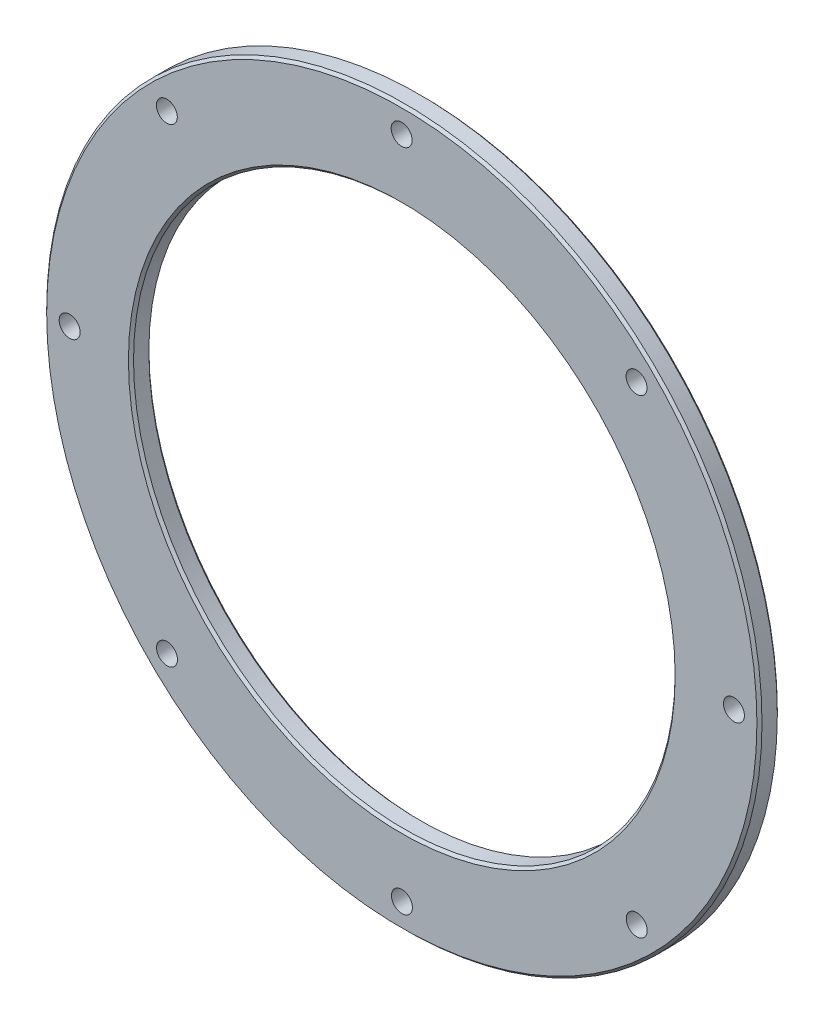
ISO-10303-21;
HEADER;
FILE_DESCRIPTION(('STEP AP214'),'2;1');
FILE_NAME('part.step','',(''),(''),'','','');
FILE_SCHEMA(('AUTOMOTIVE_DESIGN { 1 0 10303 214 1 1 1 1 }'));
ENDSEC;
DATA;
#1=APPLICATION_CONTEXT('core data for automotive mechanical design processes');
#2=APPLICATION_PROTOCOL_DEFINITION('international standard','automotive_design',2000,#1);
#3=PRODUCT_CONTEXT('',#1,'mechanical');
#4=PRODUCT('Part','Part','',(#3));
#5=PRODUCT_RELATED_PRODUCT_CATEGORY('part','',(#4));
#6=PRODUCT_DEFINITION_FORMATION('','',#4);
#7=PRODUCT_DEFINITION_CONTEXT('part definition',#1,'design');
#8=PRODUCT_DEFINITION('design','',#6,#7);
#9=PRODUCT_DEFINITION_SHAPE('','',#8);
#10=(LENGTH_UNIT() NAMED_UNIT(*) SI_UNIT(.MILLI.,.METRE.));
#11=(NAMED_UNIT(*) PLANE_ANGLE_UNIT() SI_UNIT($,.RADIAN.));
#12=(NAMED_UNIT(*) SI_UNIT($,.STERADIAN.) SOLID_ANGLE_UNIT());
#13=UNCERTAINTY_MEASURE_WITH_UNIT(LENGTH_MEASURE(1.E-05),#10,'distance_accuracy_value','');
#14=(GEOMETRIC_REPRESENTATION_CONTEXT(3) GLOBAL_UNCERTAINTY_ASSIGNED_CONTEXT((#13)) GLOBAL_UNIT_ASSIGNED_CONTEXT((#10,
#11,#12)) REPRESENTATION_CONTEXT('',''));
#15=CARTESIAN_POINT('',(0.,0.,0.));
#16=DIRECTION('',(0.,0.,1.));
#17=DIRECTION('',(1.,0.,0.));
#18=AXIS2_PLACEMENT_3D('',#15,#16,#17);
#19=CARTESIAN_POINT('',(0.,0.,0.));
#20=DIRECTION('',(0.,0.,-1.));
#21=DIRECTION('',(-1.,0.,0.));
#22=AXIS2_PLACEMENT_3D('',#19,#20,#21);
#23=CYLINDRICAL_SURFACE('',#22,140.);
#24=CARTESIAN_POINT('',(0.,0.,-7.00000000000006));
#25=DIRECTION('',(0.,0.,1.));
#26=DIRECTION('',(1.,0.,0.));
#27=AXIS2_PLACEMENT_3D('',#24,#25,#26);
#28=CIRCLE('',#27,140.);
#29=CARTESIAN_POINT('',(140.,0.,-7.00000000000006));
#30=VERTEX_POINT('',#29);
#31=EDGE_CURVE('E10',#30,#30,#28,.T.);
#32=ORIENTED_EDGE('',*,*,#31,.T.);
#33=EDGE_LOOP('',(#32));
#34=FACE_BOUND('',#33,.T.);
#35=CARTESIAN_POINT('',(0.,0.,-1.00000000000003));
#36=DIRECTION('',(0.,0.,1.));
#37=DIRECTION('',(1.,0.,0.));
#38=AXIS2_PLACEMENT_3D('',#35,#36,#37);
#39=CIRCLE('',#38,140.);
#40=CARTESIAN_POINT('',(140.,0.,-1.00000000000003));
#41=VERTEX_POINT('',#40);
#42=EDGE_CURVE('E57',#41,#41,#39,.F.);
#43=ORIENTED_EDGE('',*,*,#42,.T.);
#44=EDGE_LOOP('',(#43));
#45=FACE_BOUND('',#44,.T.);
#46=ADVANCED_FACE('F49',(#34,#45),#23,.T.);
#47=CARTESIAN_POINT('',(0.,0.,0.));
#48=DIRECTION('',(0.,0.,1.));
#49=DIRECTION('',(1.,0.,0.));
#50=AXIS2_PLACEMENT_3D('',#47,#48,#49);
#51=PLANE('',#50);
#52=CARTESIAN_POINT('',(0.,0.,0.));
#53=DIRECTION('',(0.,0.,1.));
#54=DIRECTION('',(1.,0.,0.));
#55=AXIS2_PLACEMENT_3D('',#52,#53,#54);
#56=CIRCLE('',#55,107.);
#57=CARTESIAN_POINT('',(107.,0.,0.));
#58=VERTEX_POINT('',#57);
#59=EDGE_CURVE('E76',#58,#58,#56,.F.);
#60=ORIENTED_EDGE('',*,*,#59,.T.);
#61=EDGE_LOOP('',(#60));
#62=FACE_BOUND('',#61,.T.);
#63=CARTESIAN_POINT('',(0.,0.,0.));
#64=DIRECTION('',(0.,0.,1.));
#65=DIRECTION('',(1.,0.,0.));
#66=AXIS2_PLACEMENT_3D('',#63,#64,#65);
#67=CIRCLE('',#66,139.);
#68=CARTESIAN_POINT('',(139.,0.,0.));
#69=VERTEX_POINT('',#68);
#70=EDGE_CURVE('E79',#69,#69,#67,.T.);
#71=ORIENTED_EDGE('',*,*,#70,.T.);
#72=EDGE_LOOP('',(#71));
#73=FACE_BOUND('',#72,.T.);
#74=CARTESIAN_POINT('',(-0.0514447332705628,129.99998982092,0.));
#75=DIRECTION('',(0.,0.,-1.));
#76=DIRECTION('',(1.,0.,0.));
#77=AXIS2_PLACEMENT_3D('',#74,#75,#76);
#78=CIRCLE('',#77,4.1);
#79=CARTESIAN_POINT('',(4.04855526672944,129.99998982092,0.));
#80=VERTEX_POINT('',#79);
#81=EDGE_CURVE('E122',#80,#80,#78,.T.);
#82=ORIENTED_EDGE('',*,*,#81,.T.);
#83=EDGE_LOOP('',(#82));
#84=FACE_BOUND('',#83,.T.);
#85=CARTESIAN_POINT('',(91.8874974368031,91.9602512763069,0.));
#86=DIRECTION('',(0.,0.,-1.));
#87=DIRECTION('',(1.,0.,0.));
#88=AXIS2_PLACEMENT_3D('',#85,#86,#87);
#89=CIRCLE('',#88,4.10000000000001);
#90=CARTESIAN_POINT('',(95.9874974368031,91.9602512763069,0.));
#91=VERTEX_POINT('',#90);
#92=EDGE_CURVE('E116',#91,#91,#89,.T.);
#93=ORIENTED_EDGE('',*,*,#92,.T.);
#94=EDGE_LOOP('',(#93));
#95=FACE_BOUND('',#94,.T.);
#96=CARTESIAN_POINT('',(129.99998982092,0.0514447332705389,0.));
#97=DIRECTION('',(0.,0.,-1.));
#98=DIRECTION('',(1.,0.,0.));
#99=AXIS2_PLACEMENT_3D('',#96,#97,#98);
#100=CIRCLE('',#99,4.09999999999999);
#101=CARTESIAN_POINT('',(134.09998982092,0.0514447332705389,0.));
#102=VERTEX_POINT('',#101);
#103=EDGE_CURVE('E110',#102,#102,#100,.T.);
#104=ORIENTED_EDGE('',*,*,#103,.T.);
#105=EDGE_LOOP('',(#104));
#106=FACE_BOUND('',#105,.T.);
#107=CARTESIAN_POINT('',(91.960251276307,-91.8874974368031,0.));
#108=DIRECTION('',(0.,0.,-1.));
#109=DIRECTION('',(1.,0.,0.));
#110=AXIS2_PLACEMENT_3D('',#107,#108,#109);
#111=CIRCLE('',#110,4.10000000000001);
#112=CARTESIAN_POINT('',(96.060251276307,-91.8874974368031,0.));
#113=VERTEX_POINT('',#112);
#114=EDGE_CURVE('E104',#113,#113,#111,.T.);
#115=ORIENTED_EDGE('',*,*,#114,.T.);
#116=EDGE_LOOP('',(#115));
#117=FACE_BOUND('',#116,.T.);
#118=CARTESIAN_POINT('',(0.0514447332705469,-129.99998982092,0.));
#119=DIRECTION('',(0.,0.,-1.));
#120=DIRECTION('',(1.,0.,0.));
#121=AXIS2_PLACEMENT_3D('',#118,#119,#120);
#122=CIRCLE('',#121,4.1);
#123=CARTESIAN_POINT('',(4.15144473327055,-129.99998982092,0.));
#124=VERTEX_POINT('',#123);
#125=EDGE_CURVE('E98',#124,#124,#122,.T.);
#126=ORIENTED_EDGE('',*,*,#125,.T.);
#127=EDGE_LOOP('',(#126));
#128=FACE_BOUND('',#127,.T.);
#129=CARTESIAN_POINT('',(-91.887497436803,-91.960251276307,0.));
#130=DIRECTION('',(0.,0.,-1.));
#131=DIRECTION('',(1.,0.,0.));
#132=AXIS2_PLACEMENT_3D('',#129,#130,#131);
#133=CIRCLE('',#132,4.10000000000001);
#134=CARTESIAN_POINT('',(-87.787497436803,-91.960251276307,0.));
#135=VERTEX_POINT('',#134);
#136=EDGE_CURVE('E92',#135,#135,#133,.T.);
#137=ORIENTED_EDGE('',*,*,#136,.T.);
#138=EDGE_LOOP('',(#137));
#139=FACE_BOUND('',#138,.T.);
#140=CARTESIAN_POINT('',(-129.99998982092,-0.0514447332705837,0.));
#141=DIRECTION('',(0.,0.,-1.));
#142=DIRECTION('',(1.,0.,0.));
#143=AXIS2_PLACEMENT_3D('',#140,#141,#142);
#144=CIRCLE('',#143,4.09999999999999);
#145=CARTESIAN_POINT('',(-125.89998982092,-0.0514447332705837,0.));
#146=VERTEX_POINT('',#145);
#147=EDGE_CURVE('E86',#146,#146,#144,.T.);
#148=ORIENTED_EDGE('',*,*,#147,.T.);
#149=EDGE_LOOP('',(#148));
#150=FACE_BOUND('',#149,.T.);
#151=CARTESIAN_POINT('',(-91.9602512763069,91.8874974368031,0.));
#152=DIRECTION('',(0.,0.,-1.));
#153=DIRECTION('',(1.,0.,0.));
#154=AXIS2_PLACEMENT_3D('',#151,#152,#153);
#155=CIRCLE('',#154,4.10000000000001);
#156=CARTESIAN_POINT('',(-87.8602512763069,91.8874974368031,0.));
#157=VERTEX_POINT('',#156);
#158=EDGE_CURVE('E82',#157,#157,#155,.T.);
#159=ORIENTED_EDGE('',*,*,#158,.T.);
#160=EDGE_LOOP('',(#159));
#161=FACE_BOUND('',#160,.T.);
#162=ADVANCED_FACE('F131',(#62,#73,#84,#95,#106,#117,#128,#139,#150,#161),#51,.T.);
#163=CARTESIAN_POINT('',(0.,0.,-8.));
#164=DIRECTION('',(0.,0.,1.));
#165=DIRECTION('',(1.,0.,0.));
#166=AXIS2_PLACEMENT_3D('',#163,#164,#165);
#167=PLANE('',#166);
#168=CARTESIAN_POINT('',(0.,0.,-8.));
#169=DIRECTION('',(0.,0.,1.));
#170=DIRECTION('',(1.,0.,0.));
#171=AXIS2_PLACEMENT_3D('',#168,#169,#170);
#172=CIRCLE('',#171,107.);
#173=CARTESIAN_POINT('',(107.,0.,-8.));
#174=VERTEX_POINT('',#173);
#175=EDGE_CURVE('E61',#174,#174,#172,.T.);
#176=ORIENTED_EDGE('',*,*,#175,.T.);
#177=EDGE_LOOP('',(#176));
#178=FACE_BOUND('',#177,.T.);
#179=CARTESIAN_POINT('',(0.,0.,-8.));
#180=DIRECTION('',(0.,0.,1.));
#181=DIRECTION('',(1.,0.,0.));
#182=AXIS2_PLACEMENT_3D('',#179,#180,#181);
#183=CIRCLE('',#182,139.);
#184=CARTESIAN_POINT('',(139.,0.,-8.));
#185=VERTEX_POINT('',#184);
#186=EDGE_CURVE('E65',#185,#185,#183,.F.);
#187=ORIENTED_EDGE('',*,*,#186,.T.);
#188=EDGE_LOOP('',(#187));
#189=FACE_BOUND('',#188,.T.);
#190=CARTESIAN_POINT('',(-0.0514447332705628,129.99998982092,-8.));
#191=DIRECTION('',(0.,0.,-1.));
#192=DIRECTION('',(1.,0.,0.));
#193=AXIS2_PLACEMENT_3D('',#190,#191,#192);
#194=CIRCLE('',#193,4.1);
#195=CARTESIAN_POINT('',(4.04855526672944,129.99998982092,-8.));
#196=VERTEX_POINT('',#195);
#197=EDGE_CURVE('E125',#196,#196,#194,.T.);
#198=ORIENTED_EDGE('',*,*,#197,.F.);
#199=EDGE_LOOP('',(#198));
#200=FACE_BOUND('',#199,.T.);
#201=CARTESIAN_POINT('',(91.8874974368031,91.9602512763069,-8.));
#202=DIRECTION('',(0.,0.,-1.));
#203=DIRECTION('',(1.,0.,0.));
#204=AXIS2_PLACEMENT_3D('',#201,#202,#203);
#205=CIRCLE('',#204,4.10000000000001);
#206=CARTESIAN_POINT('',(95.9874974368031,91.9602512763069,-8.));
#207=VERTEX_POINT('',#206);
#208=EDGE_CURVE('E119',#207,#207,#205,.T.);
#209=ORIENTED_EDGE('',*,*,#208,.F.);
#210=EDGE_LOOP('',(#209));
#211=FACE_BOUND('',#210,.T.);
#212=CARTESIAN_POINT('',(129.99998982092,0.0514447332705389,-8.));
#213=DIRECTION('',(0.,0.,-1.));
#214=DIRECTION('',(1.,0.,0.));
#215=AXIS2_PLACEMENT_3D('',#212,#213,#214);
#216=CIRCLE('',#215,4.09999999999999);
#217=CARTESIAN_POINT('',(134.09998982092,0.0514447332705389,-8.));
#218=VERTEX_POINT('',#217);
#219=EDGE_CURVE('E113',#218,#218,#216,.T.);
#220=ORIENTED_EDGE('',*,*,#219,.F.);
#221=EDGE_LOOP('',(#220));
#222=FACE_BOUND('',#221,.T.);
#223=CARTESIAN_POINT('',(91.960251276307,-91.8874974368031,-8.));
#224=DIRECTION('',(0.,0.,-1.));
#225=DIRECTION('',(1.,0.,0.));
#226=AXIS2_PLACEMENT_3D('',#223,#224,#225);
#227=CIRCLE('',#226,4.10000000000001);
#228=CARTESIAN_POINT('',(96.060251276307,-91.8874974368031,-8.));
#229=VERTEX_POINT('',#228);
#230=EDGE_CURVE('E107',#229,#229,#227,.T.);
#231=ORIENTED_EDGE('',*,*,#230,.F.);
#232=EDGE_LOOP('',(#231));
#233=FACE_BOUND('',#232,.T.);
#234=CARTESIAN_POINT('',(0.0514447332705469,-129.99998982092,-8.));
#235=DIRECTION('',(0.,0.,-1.));
#236=DIRECTION('',(1.,0.,0.));
#237=AXIS2_PLACEMENT_3D('',#234,#235,#236);
#238=CIRCLE('',#237,4.1);
#239=CARTESIAN_POINT('',(4.15144473327055,-129.99998982092,-8.));
#240=VERTEX_POINT('',#239);
#241=EDGE_CURVE('E101',#240,#240,#238,.T.);
#242=ORIENTED_EDGE('',*,*,#241,.F.);
#243=EDGE_LOOP('',(#242));
#244=FACE_BOUND('',#243,.T.);
#245=CARTESIAN_POINT('',(-91.887497436803,-91.960251276307,-8.));
#246=DIRECTION('',(0.,0.,-1.));
#247=DIRECTION('',(1.,0.,0.));
#248=AXIS2_PLACEMENT_3D('',#245,#246,#247);
#249=CIRCLE('',#248,4.10000000000001);
#250=CARTESIAN_POINT('',(-87.787497436803,-91.960251276307,-8.));
#251=VERTEX_POINT('',#250);
#252=EDGE_CURVE('E95',#251,#251,#249,.T.);
#253=ORIENTED_EDGE('',*,*,#252,.F.);
#254=EDGE_LOOP('',(#253));
#255=FACE_BOUND('',#254,.T.);
#256=CARTESIAN_POINT('',(-129.99998982092,-0.0514447332705837,-8.));
#257=DIRECTION('',(0.,0.,-1.));
#258=DIRECTION('',(1.,0.,0.));
#259=AXIS2_PLACEMENT_3D('',#256,#257,#258);
#260=CIRCLE('',#259,4.09999999999999);
#261=CARTESIAN_POINT('',(-125.89998982092,-0.0514447332705837,-8.));
#262=VERTEX_POINT('',#261);
#263=EDGE_CURVE('E89',#262,#262,#260,.T.);
#264=ORIENTED_EDGE('',*,*,#263,.F.);
#265=EDGE_LOOP('',(#264));
#266=FACE_BOUND('',#265,.T.);
#267=CARTESIAN_POINT('',(-91.9602512763069,91.8874974368031,-8.));
#268=DIRECTION('',(0.,0.,-1.));
#269=DIRECTION('',(1.,0.,0.));
#270=AXIS2_PLACEMENT_3D('',#267,#268,#269);
#271=CIRCLE('',#270,4.10000000000001);
#272=CARTESIAN_POINT('',(-87.8602512763069,91.8874974368031,-8.));
#273=VERTEX_POINT('',#272);
#274=EDGE_CURVE('E83',#273,#273,#271,.T.);
#275=ORIENTED_EDGE('',*,*,#274,.F.);
#276=EDGE_LOOP('',(#275));
#277=FACE_BOUND('',#276,.T.);
#278=ADVANCED_FACE('F142',(#178,#189,#200,#211,#222,#233,#244,#255,#266,#277),#167,.F.);
#279=CARTESIAN_POINT('',(-91.9602512763069,91.8874974368031,0.));
#280=DIRECTION('',(0.,0.,-1.));
#281=DIRECTION('',(-1.,0.,0.));
#282=AXIS2_PLACEMENT_3D('',#279,#280,#281);
#283=CYLINDRICAL_SURFACE('',#282,4.10000000000001);
#284=ORIENTED_EDGE('',*,*,#158,.F.);
#285=EDGE_LOOP('',(#284));
#286=FACE_BOUND('',#285,.T.);
#287=ORIENTED_EDGE('',*,*,#274,.T.);
#288=EDGE_LOOP('',(#287));
#289=FACE_BOUND('',#288,.T.);
#290=ADVANCED_FACE('F145',(#286,#289),#283,.F.);
#291=CARTESIAN_POINT('',(-129.99998982092,-0.0514447332705837,0.));
#292=DIRECTION('',(0.,0.,-1.));
#293=DIRECTION('',(-1.,0.,0.));
#294=AXIS2_PLACEMENT_3D('',#291,#292,#293);
#295=CYLINDRICAL_SURFACE('',#294,4.09999999999999);
#296=ORIENTED_EDGE('',*,*,#147,.F.);
#297=EDGE_LOOP('',(#296));
#298=FACE_BOUND('',#297,.T.);
#299=ORIENTED_EDGE('',*,*,#263,.T.);
#300=EDGE_LOOP('',(#299));
#301=FACE_BOUND('',#300,.T.);
#302=ADVANCED_FACE('F163',(#298,#301),#295,.F.);
#303=CARTESIAN_POINT('',(-91.887497436803,-91.960251276307,0.));
#304=DIRECTION('',(0.,0.,-1.));
#305=DIRECTION('',(-1.,0.,0.));
#306=AXIS2_PLACEMENT_3D('',#303,#304,#305);
#307=CYLINDRICAL_SURFACE('',#306,4.10000000000001);
#308=ORIENTED_EDGE('',*,*,#136,.F.);
#309=EDGE_LOOP('',(#308));
#310=FACE_BOUND('',#309,.T.);
#311=ORIENTED_EDGE('',*,*,#252,.T.);
#312=EDGE_LOOP('',(#311));
#313=FACE_BOUND('',#312,.T.);
#314=ADVANCED_FACE('F169',(#310,#313),#307,.F.);
#315=CARTESIAN_POINT('',(0.0514447332705469,-129.99998982092,0.));
#316=DIRECTION('',(0.,0.,-1.));
#317=DIRECTION('',(-1.,0.,0.));
#318=AXIS2_PLACEMENT_3D('',#315,#316,#317);
#319=CYLINDRICAL_SURFACE('',#318,4.1);
#320=ORIENTED_EDGE('',*,*,#125,.F.);
#321=EDGE_LOOP('',(#320));
#322=FACE_BOUND('',#321,.T.);
#323=ORIENTED_EDGE('',*,*,#241,.T.);
#324=EDGE_LOOP('',(#323));
#325=FACE_BOUND('',#324,.T.);
#326=ADVANCED_FACE('F273',(#322,#325),#319,.F.);
#327=CARTESIAN_POINT('',(91.960251276307,-91.8874974368031,0.));
#328=DIRECTION('',(0.,0.,-1.));
#329=DIRECTION('',(-1.,0.,0.));
#330=AXIS2_PLACEMENT_3D('',#327,#328,#329);
#331=CYLINDRICAL_SURFACE('',#330,4.10000000000001);
#332=ORIENTED_EDGE('',*,*,#114,.F.);
#333=EDGE_LOOP('',(#332));
#334=FACE_BOUND('',#333,.T.);
#335=ORIENTED_EDGE('',*,*,#230,.T.);
#336=EDGE_LOOP('',(#335));
#337=FACE_BOUND('',#336,.T.);
#338=ADVANCED_FACE('F263',(#334,#337),#331,.F.);
#339=CARTESIAN_POINT('',(129.99998982092,0.0514447332705389,0.));
#340=DIRECTION('',(0.,0.,-1.));
#341=DIRECTION('',(-1.,0.,0.));
#342=AXIS2_PLACEMENT_3D('',#339,#340,#341);
#343=CYLINDRICAL_SURFACE('',#342,4.09999999999999);
#344=ORIENTED_EDGE('',*,*,#103,.F.);
#345=EDGE_LOOP('',(#344));
#346=FACE_BOUND('',#345,.T.);
#347=ORIENTED_EDGE('',*,*,#219,.T.);
#348=EDGE_LOOP('',(#347));
#349=FACE_BOUND('',#348,.T.);
#350=ADVANCED_FACE('F253',(#346,#349),#343,.F.);
#351=CARTESIAN_POINT('',(91.8874974368031,91.9602512763069,0.));
#352=DIRECTION('',(0.,0.,-1.));
#353=DIRECTION('',(-1.,0.,0.));
#354=AXIS2_PLACEMENT_3D('',#351,#352,#353);
#355=CYLINDRICAL_SURFACE('',#354,4.10000000000001);
#356=ORIENTED_EDGE('',*,*,#92,.F.);
#357=EDGE_LOOP('',(#356));
#358=FACE_BOUND('',#357,.T.);
#359=ORIENTED_EDGE('',*,*,#208,.T.);
#360=EDGE_LOOP('',(#359));
#361=FACE_BOUND('',#360,.T.);
#362=ADVANCED_FACE('F138',(#358,#361),#355,.F.);
#363=CARTESIAN_POINT('',(-0.0514447332705628,129.99998982092,0.));
#364=DIRECTION('',(0.,0.,-1.));
#365=DIRECTION('',(-1.,0.,0.));
#366=AXIS2_PLACEMENT_3D('',#363,#364,#365);
#367=CYLINDRICAL_SURFACE('',#366,4.1);
#368=ORIENTED_EDGE('',*,*,#81,.F.);
#369=EDGE_LOOP('',(#368));
#370=FACE_BOUND('',#369,.T.);
#371=ORIENTED_EDGE('',*,*,#197,.T.);
#372=EDGE_LOOP('',(#371));
#373=FACE_BOUND('',#372,.T.);
#374=ADVANCED_FACE('F134',(#370,#373),#367,.F.);
#375=CARTESIAN_POINT('',(0.,0.,0.));
#376=DIRECTION('',(0.,0.,-1.));
#377=DIRECTION('',(-1.,0.,0.));
#378=AXIS2_PLACEMENT_3D('',#375,#376,#377);
#379=CYLINDRICAL_SURFACE('',#378,106.);
#380=CARTESIAN_POINT('',(0.,0.,-0.999999999999973));
#381=DIRECTION('',(0.,0.,1.));
#382=DIRECTION('',(1.,0.,0.));
#383=AXIS2_PLACEMENT_3D('',#380,#381,#382);
#384=CIRCLE('',#383,106.);
#385=CARTESIAN_POINT('',(106.,0.,-0.999999999999973));
#386=VERTEX_POINT('',#385);
#387=EDGE_CURVE('E70',#386,#386,#384,.T.);
#388=ORIENTED_EDGE('',*,*,#387,.T.);
#389=EDGE_LOOP('',(#388));
#390=FACE_BOUND('',#389,.T.);
#391=CARTESIAN_POINT('',(0.,0.,-7.));
#392=DIRECTION('',(0.,0.,1.));
#393=DIRECTION('',(1.,0.,0.));
#394=AXIS2_PLACEMENT_3D('',#391,#392,#393);
#395=CIRCLE('',#394,106.);
#396=CARTESIAN_POINT('',(106.,0.,-7.));
#397=VERTEX_POINT('',#396);
#398=EDGE_CURVE('E73',#397,#397,#395,.F.);
#399=ORIENTED_EDGE('',*,*,#398,.T.);
#400=EDGE_LOOP('',(#399));
#401=FACE_BOUND('',#400,.T.);
#402=ADVANCED_FACE('F137',(#390,#401),#379,.F.);
#403=CARTESIAN_POINT('',(0.,0.,0.));
#404=DIRECTION('',(0.,0.,1.));
#405=DIRECTION('',(1.,0.,0.));
#406=AXIS2_PLACEMENT_3D('',#403,#404,#405);
#407=CONICAL_SURFACE('',#406,107.,0.785398163397462);
#408=ORIENTED_EDGE('',*,*,#387,.F.);
#409=EDGE_LOOP('',(#408));
#410=FACE_BOUND('',#409,.T.);
#411=ORIENTED_EDGE('',*,*,#59,.F.);
#412=EDGE_LOOP('',(#411));
#413=FACE_BOUND('',#412,.T.);
#414=ADVANCED_FACE('F182',(#410,#413),#407,.F.);
#415=CARTESIAN_POINT('',(0.,0.,-7.));
#416=DIRECTION('',(0.,0.,-1.));
#417=DIRECTION('',(-1.,0.,0.));
#418=AXIS2_PLACEMENT_3D('',#415,#416,#417);
#419=CONICAL_SURFACE('',#418,106.,0.785398163397462);
#420=ORIENTED_EDGE('',*,*,#175,.F.);
#421=EDGE_LOOP('',(#420));
#422=FACE_BOUND('',#421,.T.);
#423=ORIENTED_EDGE('',*,*,#398,.F.);
#424=EDGE_LOOP('',(#423));
#425=FACE_BOUND('',#424,.T.);
#426=ADVANCED_FACE('F188',(#422,#425),#419,.F.);
#427=CARTESIAN_POINT('',(0.,0.,-8.));
#428=DIRECTION('',(0.,0.,1.));
#429=DIRECTION('',(1.,0.,0.));
#430=AXIS2_PLACEMENT_3D('',#427,#428,#429);
#431=CONICAL_SURFACE('',#430,139.,0.785398163397476);
#432=ORIENTED_EDGE('',*,*,#31,.F.);
#433=EDGE_LOOP('',(#432));
#434=FACE_BOUND('',#433,.T.);
#435=ORIENTED_EDGE('',*,*,#186,.F.);
#436=EDGE_LOOP('',(#435));
#437=FACE_BOUND('',#436,.T.);
#438=ADVANCED_FACE('F194',(#434,#437),#431,.T.);
#439=CARTESIAN_POINT('',(0.,0.,-1.00000000000003));
#440=DIRECTION('',(0.,0.,-1.));
#441=DIRECTION('',(-1.,0.,0.));
#442=AXIS2_PLACEMENT_3D('',#439,#440,#441);
#443=CONICAL_SURFACE('',#442,140.,0.785398163397462);
#444=ORIENTED_EDGE('',*,*,#70,.F.);
#445=EDGE_LOOP('',(#444));
#446=FACE_BOUND('',#445,.T.);
#447=ORIENTED_EDGE('',*,*,#42,.F.);
#448=EDGE_LOOP('',(#447));
#449=FACE_BOUND('',#448,.T.);
#450=ADVANCED_FACE('F52',(#446,#449),#443,.T.);
#451=CLOSED_SHELL('',(#46,#162,#278,#290,#302,#314,#326,#338,#350,#362,#374,#402,#414,#426,#438,#450));
#452=MANIFOLD_SOLID_BREP('B2',#451);
#453=ADVANCED_BREP_SHAPE_REPRESENTATION('',(#18,#452),#14);
#454=SHAPE_DEFINITION_REPRESENTATION(#9,#453);
ENDSEC;
END-ISO-10303-21;
